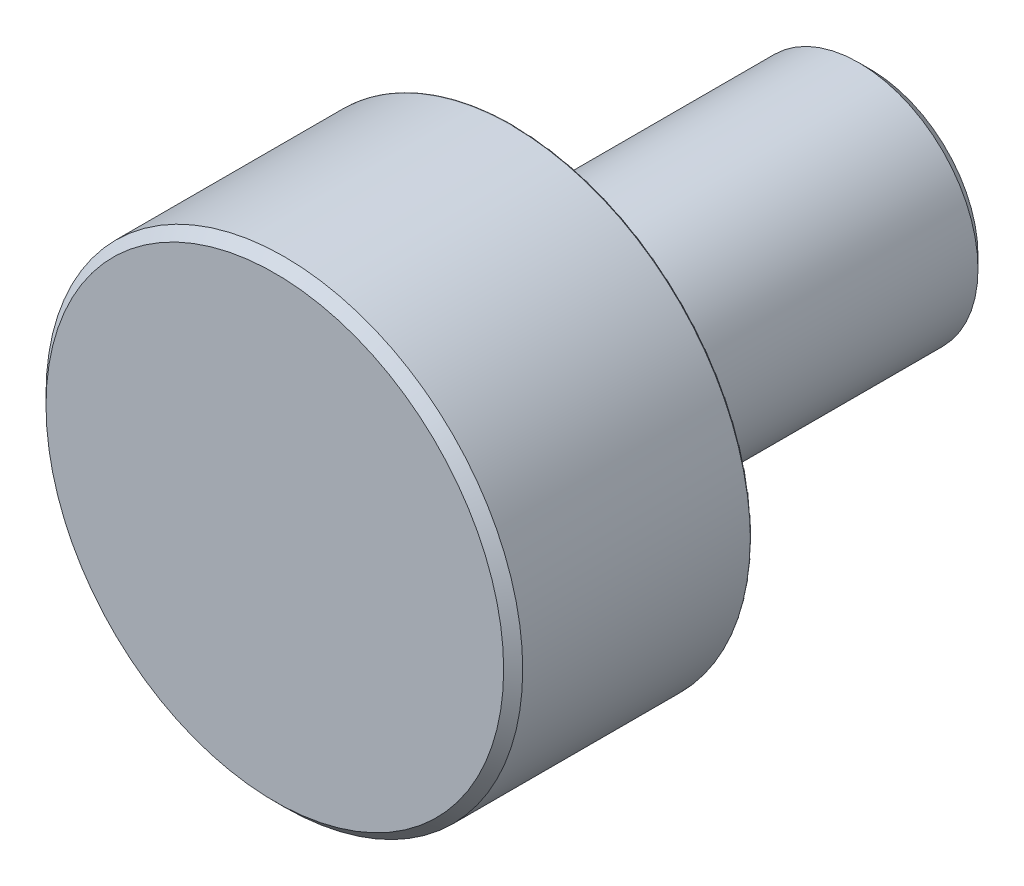
ISO-10303-21;
HEADER;
FILE_DESCRIPTION(('STEP AP214'),'2;1');
FILE_NAME('part.step','',(''),(''),'','','');
FILE_SCHEMA(('AUTOMOTIVE_DESIGN { 1 0 10303 214 1 1 1 1 }'));
ENDSEC;
DATA;
#1=APPLICATION_CONTEXT('core data for automotive mechanical design processes');
#2=APPLICATION_PROTOCOL_DEFINITION('international standard','automotive_design',2000,#1);
#3=PRODUCT_CONTEXT('',#1,'mechanical');
#4=PRODUCT('Part','Part','',(#3));
#5=PRODUCT_RELATED_PRODUCT_CATEGORY('part','',(#4));
#6=PRODUCT_DEFINITION_FORMATION('','',#4);
#7=PRODUCT_DEFINITION_CONTEXT('part definition',#1,'design');
#8=PRODUCT_DEFINITION('design','',#6,#7);
#9=PRODUCT_DEFINITION_SHAPE('','',#8);
#10=(LENGTH_UNIT() NAMED_UNIT(*) SI_UNIT(.MILLI.,.METRE.));
#11=(NAMED_UNIT(*) PLANE_ANGLE_UNIT() SI_UNIT($,.RADIAN.));
#12=(NAMED_UNIT(*) SI_UNIT($,.STERADIAN.) SOLID_ANGLE_UNIT());
#13=UNCERTAINTY_MEASURE_WITH_UNIT(LENGTH_MEASURE(1.E-05),#10,'distance_accuracy_value','');
#14=(GEOMETRIC_REPRESENTATION_CONTEXT(3) GLOBAL_UNCERTAINTY_ASSIGNED_CONTEXT((#13)) GLOBAL_UNIT_ASSIGNED_CONTEXT((#10,
#11,#12)) REPRESENTATION_CONTEXT('',''));
#15=CARTESIAN_POINT('',(0.,0.,0.));
#16=DIRECTION('',(0.,0.,1.));
#17=DIRECTION('',(1.,0.,0.));
#18=AXIS2_PLACEMENT_3D('',#15,#16,#17);
#19=CARTESIAN_POINT('',(0.,0.,7.99999999999956));
#20=DIRECTION('',(0.,0.,-0.999999999999999));
#21=DIRECTION('',(-1.,0.,0.));
#22=AXIS2_PLACEMENT_3D('',#19,#20,#21);
#23=PLANE('',#22);
#24=CARTESIAN_POINT('',(0.,0.,7.99999999999956));
#25=DIRECTION('',(0.,0.,-0.999999999999999));
#26=DIRECTION('',(-1.,0.,0.));
#27=AXIS2_PLACEMENT_3D('',#24,#25,#26);
#28=CIRCLE('',#27,7.68000000000001);
#29=CARTESIAN_POINT('',(-7.68000000000001,0.,7.99999999999956));
#30=VERTEX_POINT('',#29);
#31=EDGE_CURVE('E61',#30,#30,#28,.F.);
#32=ORIENTED_EDGE('',*,*,#31,.T.);
#33=EDGE_LOOP('',(#32));
#34=FACE_BOUND('',#33,.T.);
#35=ADVANCED_FACE('F41',(#34),#23,.F.);
#36=CARTESIAN_POINT('',(0.,0.,12.6999999999997));
#37=DIRECTION('',(0.,0.,0.999999999999999));
#38=DIRECTION('',(1.,0.,0.));
#39=AXIS2_PLACEMENT_3D('',#36,#37,#38);
#40=CYLINDRICAL_SURFACE('',#39,8.);
#41=CARTESIAN_POINT('',(0.,0.,7.67999999999969));
#42=DIRECTION('',(0.,0.,-0.999999999999999));
#43=DIRECTION('',(-1.,0.,0.));
#44=AXIS2_PLACEMENT_3D('',#41,#42,#43);
#45=CIRCLE('',#44,8.);
#46=CARTESIAN_POINT('',(8.,0.,7.67999999999969));
#47=VERTEX_POINT('',#46);
#48=EDGE_CURVE('E55',#47,#47,#45,.T.);
#49=CARTESIAN_POINT('',(0.,0.,0.0499999999999945));
#50=DIRECTION('',(0.,0.,0.999999999999999));
#51=DIRECTION('',(1.,0.,0.));
#52=AXIS2_PLACEMENT_3D('',#49,#50,#51);
#53=CIRCLE('',#52,8.);
#54=CARTESIAN_POINT('',(8.,0.,0.0499999999999945));
#55=VERTEX_POINT('',#54);
#56=EDGE_CURVE('E67',#55,#55,#53,.T.);
#57=CARTESIAN_POINT('',(8.,0.,7.67999999999969));
#58=CARTESIAN_POINT('',(8.,0.,7.60052083333302));
#59=CARTESIAN_POINT('',(8.,0.,7.52104166666636));
#60=CARTESIAN_POINT('',(8.,0.,7.36208333333303));
#61=CARTESIAN_POINT('',(8.,0.,7.28260416666637));
#62=CARTESIAN_POINT('',(8.,0.,7.12364583333304));
#63=CARTESIAN_POINT('',(8.,0.,7.04416666666638));
#64=CARTESIAN_POINT('',(8.,0.,6.88520833333305));
#65=CARTESIAN_POINT('',(8.,0.,6.80572916666639));
#66=CARTESIAN_POINT('',(8.,0.,6.64677083333306));
#67=CARTESIAN_POINT('',(8.,0.,6.5672916666664));
#68=CARTESIAN_POINT('',(8.,0.,6.40833333333307));
#69=CARTESIAN_POINT('',(8.,0.,6.32885416666641));
#70=CARTESIAN_POINT('',(8.,0.,6.16989583333308));
#71=CARTESIAN_POINT('',(8.,0.,6.09041666666642));
#72=CARTESIAN_POINT('',(8.,0.,5.93145833333309));
#73=CARTESIAN_POINT('',(8.,0.,5.85197916666643));
#74=CARTESIAN_POINT('',(8.,0.,5.6930208333331));
#75=CARTESIAN_POINT('',(8.,0.,5.61354166666644));
#76=CARTESIAN_POINT('',(8.,0.,5.45458333333311));
#77=CARTESIAN_POINT('',(8.,0.,5.37510416666645));
#78=CARTESIAN_POINT('',(8.,0.,5.21614583333312));
#79=CARTESIAN_POINT('',(8.,0.,5.13666666666646));
#80=CARTESIAN_POINT('',(8.,0.,4.97770833333313));
#81=CARTESIAN_POINT('',(8.,0.,4.89822916666647));
#82=CARTESIAN_POINT('',(8.,0.,4.73927083333314));
#83=CARTESIAN_POINT('',(8.,0.,4.65979166666648));
#84=CARTESIAN_POINT('',(8.,0.,4.50083333333315));
#85=CARTESIAN_POINT('',(8.,0.,4.42135416666649));
#86=CARTESIAN_POINT('',(8.,0.,4.26239583333316));
#87=CARTESIAN_POINT('',(8.,0.,4.18291666666649));
#88=CARTESIAN_POINT('',(8.,0.,4.02395833333317));
#89=CARTESIAN_POINT('',(8.,0.,3.94447916666651));
#90=CARTESIAN_POINT('',(8.,0.,3.78552083333318));
#91=CARTESIAN_POINT('',(8.,0.,3.70604166666652));
#92=CARTESIAN_POINT('',(8.,0.,3.54708333333319));
#93=CARTESIAN_POINT('',(8.,0.,3.46760416666653));
#94=CARTESIAN_POINT('',(8.,0.,3.3086458333332));
#95=CARTESIAN_POINT('',(8.,0.,3.22916666666653));
#96=CARTESIAN_POINT('',(8.,0.,3.07020833333321));
#97=CARTESIAN_POINT('',(8.,0.,2.99072916666654));
#98=CARTESIAN_POINT('',(8.,0.,2.83177083333322));
#99=CARTESIAN_POINT('',(8.,0.,2.75229166666655));
#100=CARTESIAN_POINT('',(8.,0.,2.59333333333323));
#101=CARTESIAN_POINT('',(8.,0.,2.51385416666656));
#102=CARTESIAN_POINT('',(8.,0.,2.35489583333323));
#103=CARTESIAN_POINT('',(8.,0.,2.27541666666657));
#104=CARTESIAN_POINT('',(8.,0.,2.11645833333325));
#105=CARTESIAN_POINT('',(8.,0.,2.03697916666658));
#106=CARTESIAN_POINT('',(8.,0.,1.87802083333326));
#107=CARTESIAN_POINT('',(8.,0.,1.79854166666659));
#108=CARTESIAN_POINT('',(8.,0.,1.63958333333327));
#109=CARTESIAN_POINT('',(8.,0.,1.5601041666666));
#110=CARTESIAN_POINT('',(8.,0.,1.40114583333327));
#111=CARTESIAN_POINT('',(8.,0.,1.32166666666661));
#112=CARTESIAN_POINT('',(8.,0.,1.16270833333328));
#113=CARTESIAN_POINT('',(8.,0.,1.08322916666662));
#114=CARTESIAN_POINT('',(8.,0.,0.924270833333293));
#115=CARTESIAN_POINT('',(8.,0.,0.844791666666629));
#116=CARTESIAN_POINT('',(8.,0.,0.685833333333302));
#117=CARTESIAN_POINT('',(8.,0.,0.606354166666639));
#118=CARTESIAN_POINT('',(8.,0.,0.447395833333312));
#119=CARTESIAN_POINT('',(8.,0.,0.367916666666648));
#120=CARTESIAN_POINT('',(8.,0.,0.208958333333321));
#121=CARTESIAN_POINT('',(8.,0.,0.129479166666658));
#122=CARTESIAN_POINT('',(8.,0.,0.0499999999999945));
#123=B_SPLINE_CURVE_WITH_KNOTS('',3,(#57,#58,#59,#60,#61,#62,#63,#64,#65,#66,#67,#68,#69,#70,
#71,#72,#73,#74,#75,#76,#77,#78,#79,#80,#81,#82,#83,#84,#85,#86,#87,#88,#89,#90,#91,#92,#93,#94,
#95,#96,#97,#98,#99,#100,#101,#102,#103,#104,#105,#106,#107,#108,#109,#110,#111,#112,#113,#114,
#115,#116,#117,#118,#119,#120,#121,#122),.UNSPECIFIED.,.F.,.F.,(4,2,2,2,2,2,2,2,2,2,2,2,2,2,2,2,
2,2,2,2,2,2,2,2,2,2,2,2,2,2,2,2,4),(0.,0.23843749999999,0.47687499999998,0.715312499999971,
0.953749999999962,1.19218749999995,1.43062499999994,1.66906249999993,1.90749999999992,
2.14593749999991,2.3843749999999,2.62281249999989,2.86124999999989,3.09968749999988,
3.33812499999987,3.57656249999986,3.81499999999985,4.05343749999984,4.29187499999983,
4.53031249999982,4.76874999999981,5.0071874999998,5.24562499999979,5.48406249999978,
5.72249999999977,5.96093749999976,6.19937499999975,6.43781249999974,6.67624999999973,
6.91468749999972,7.15312499999971,7.3915624999997,7.62999999999969),.UNSPECIFIED.);
#124=EDGE_CURVE('BSEAM113',#47,#55,#123,.T.);
#125=ORIENTED_EDGE('',*,*,#48,.T.);
#126=ORIENTED_EDGE('',*,*,#56,.T.);
#127=ORIENTED_EDGE('',*,*,#124,.T.);
#128=ORIENTED_EDGE('',*,*,#124,.F.);
#129=EDGE_LOOP('',(#125,#127,#126,#128));
#130=FACE_BOUND('',#129,.T.);
#131=ADVANCED_FACE('F113',(#130),#40,.T.);
#132=CARTESIAN_POINT('',(0.,0.,0.0499999999999945));
#133=DIRECTION('',(0.,0.,0.999999999999999));
#134=DIRECTION('',(1.,0.,0.));
#135=AXIS2_PLACEMENT_3D('',#132,#133,#134);
#136=TOROIDAL_SURFACE('',#135,7.95,0.0499999999999998);
#137=ORIENTED_EDGE('',*,*,#56,.F.);
#138=EDGE_LOOP('',(#137));
#139=FACE_BOUND('',#138,.T.);
#140=CARTESIAN_POINT('',(0.,0.,0.));
#141=DIRECTION('',(0.,0.,0.999999999999999));
#142=DIRECTION('',(1.,0.,0.));
#143=AXIS2_PLACEMENT_3D('',#140,#141,#142);
#144=CIRCLE('',#143,7.95);
#145=CARTESIAN_POINT('',(7.95,0.,0.));
#146=VERTEX_POINT('',#145);
#147=EDGE_CURVE('E71',#146,#146,#144,.T.);
#148=ORIENTED_EDGE('',*,*,#147,.T.);
#149=EDGE_LOOP('',(#148));
#150=FACE_BOUND('',#149,.T.);
#151=ADVANCED_FACE('F119',(#139,#150),#136,.T.);
#152=CARTESIAN_POINT('',(0.,7.95000000000001,0.));
#153=DIRECTION('',(0.,0.,0.999999999999999));
#154=DIRECTION('',(1.,0.,0.));
#155=AXIS2_PLACEMENT_3D('',#152,#153,#154);
#156=PLANE('',#155);
#157=ORIENTED_EDGE('',*,*,#147,.F.);
#158=EDGE_LOOP('',(#157));
#159=FACE_BOUND('',#158,.T.);
#160=CARTESIAN_POINT('',(0.,0.,0.));
#161=DIRECTION('',(0.,0.,0.999999999999999));
#162=DIRECTION('',(1.,0.,0.));
#163=AXIS2_PLACEMENT_3D('',#160,#161,#162);
#164=CIRCLE('',#163,4.44721359549996);
#165=CARTESIAN_POINT('',(4.44721359549996,0.,0.));
#166=VERTEX_POINT('',#165);
#167=EDGE_CURVE('E75',#166,#166,#164,.T.);
#168=ORIENTED_EDGE('',*,*,#167,.T.);
#169=EDGE_LOOP('',(#168));
#170=FACE_BOUND('',#169,.T.);
#171=ADVANCED_FACE('F137',(#159,#170),#156,.F.);
#172=CARTESIAN_POINT('',(0.,0.,0.0499999999999945));
#173=DIRECTION('',(0.,0.,0.999999999999999));
#174=DIRECTION('',(1.,0.,0.));
#175=AXIS2_PLACEMENT_3D('',#172,#173,#174);
#176=TOROIDAL_SURFACE('',#175,4.44721359549996,0.0499999999999996);
#177=ORIENTED_EDGE('',*,*,#167,.F.);
#178=EDGE_LOOP('',(#177));
#179=FACE_BOUND('',#178,.T.);
#180=CARTESIAN_POINT('',(0.,0.,0.0444444444444581));
#181=DIRECTION('',(0.,0.,0.999999999999999));
#182=DIRECTION('',(1.,0.,0.));
#183=AXIS2_PLACEMENT_3D('',#180,#181,#182);
#184=CIRCLE('',#183,4.39752319599996);
#185=CARTESIAN_POINT('',(4.39752319599996,0.,0.0444444444444581));
#186=VERTEX_POINT('',#185);
#187=EDGE_CURVE('E79',#186,#186,#184,.T.);
#188=ORIENTED_EDGE('',*,*,#187,.T.);
#189=EDGE_LOOP('',(#188));
#190=FACE_BOUND('',#189,.T.);
#191=ADVANCED_FACE('F142',(#179,#190),#176,.T.);
#192=CARTESIAN_POINT('',(0.,0.,0.));
#193=DIRECTION('',(0.,0.,0.999999999999999));
#194=DIRECTION('',(1.,0.,0.));
#195=AXIS2_PLACEMENT_3D('',#192,#193,#194);
#196=TOROIDAL_SURFACE('',#195,4.,0.400000000000001);
#197=ORIENTED_EDGE('',*,*,#187,.F.);
#198=EDGE_LOOP('',(#197));
#199=FACE_BOUND('',#198,.T.);
#200=CARTESIAN_POINT('',(0.,0.,0.));
#201=DIRECTION('',(0.,0.,0.999999999999999));
#202=DIRECTION('',(1.,0.,0.));
#203=AXIS2_PLACEMENT_3D('',#200,#201,#202);
#204=CIRCLE('',#203,3.6);
#205=CARTESIAN_POINT('',(3.6,0.,0.));
#206=VERTEX_POINT('',#205);
#207=EDGE_CURVE('E83',#206,#206,#204,.T.);
#208=ORIENTED_EDGE('',*,*,#207,.T.);
#209=EDGE_LOOP('',(#208));
#210=FACE_BOUND('',#209,.T.);
#211=ADVANCED_FACE('F148',(#199,#210),#196,.F.);
#212=CARTESIAN_POINT('',(0.,0.,12.6999999999997));
#213=DIRECTION('',(0.,0.,0.999999999999999));
#214=DIRECTION('',(1.,0.,0.));
#215=AXIS2_PLACEMENT_3D('',#212,#213,#214);
#216=CYLINDRICAL_SURFACE('',#215,3.6);
#217=CARTESIAN_POINT('',(0.,0.,-0.800000000000023));
#218=DIRECTION('',(0.,0.,0.999999999999999));
#219=DIRECTION('',(1.,0.,0.));
#220=AXIS2_PLACEMENT_3D('',#217,#218,#219);
#221=CIRCLE('',#220,3.6);
#222=CARTESIAN_POINT('',(3.6,0.,-0.800000000000025));
#223=VERTEX_POINT('',#222);
#224=EDGE_CURVE('E87',#223,#223,#221,.T.);
#225=CARTESIAN_POINT('',(3.6,0.,0.));
#226=CARTESIAN_POINT('',(3.6,0.,-0.00833333333333531));
#227=CARTESIAN_POINT('',(3.6,0.,-0.0166666666666689));
#228=CARTESIAN_POINT('',(3.6,0.,-0.033333333333336));
#229=CARTESIAN_POINT('',(3.6,0.,-0.0416666666666696));
#230=CARTESIAN_POINT('',(3.6,0.,-0.0583333333333367));
#231=CARTESIAN_POINT('',(3.6,0.,-0.0666666666666703));
#232=CARTESIAN_POINT('',(3.6,0.,-0.0833333333333375));
#233=CARTESIAN_POINT('',(3.6,0.,-0.091666666666671));
#234=CARTESIAN_POINT('',(3.6,0.,-0.108333333333338));
#235=CARTESIAN_POINT('',(3.6,0.,-0.116666666666672));
#236=CARTESIAN_POINT('',(3.6,0.,-0.133333333333339));
#237=CARTESIAN_POINT('',(3.6,0.,-0.141666666666672));
#238=CARTESIAN_POINT('',(3.6,0.,-0.15833333333334));
#239=CARTESIAN_POINT('',(3.6,0.,-0.166666666666673));
#240=CARTESIAN_POINT('',(3.6,0.,-0.18333333333334));
#241=CARTESIAN_POINT('',(3.6,0.,-0.191666666666674));
#242=CARTESIAN_POINT('',(3.6,0.,-0.208333333333341));
#243=CARTESIAN_POINT('',(3.6,0.,-0.216666666666675));
#244=CARTESIAN_POINT('',(3.6,0.,-0.233333333333342));
#245=CARTESIAN_POINT('',(3.6,0.,-0.241666666666675));
#246=CARTESIAN_POINT('',(3.6,0.,-0.258333333333342));
#247=CARTESIAN_POINT('',(3.6,0.,-0.266666666666676));
#248=CARTESIAN_POINT('',(3.6,0.,-0.283333333333343));
#249=CARTESIAN_POINT('',(3.6,0.,-0.291666666666677));
#250=CARTESIAN_POINT('',(3.6,0.,-0.308333333333344));
#251=CARTESIAN_POINT('',(3.6,0.,-0.316666666666677));
#252=CARTESIAN_POINT('',(3.6,0.,-0.333333333333345));
#253=CARTESIAN_POINT('',(3.6,0.,-0.341666666666678));
#254=CARTESIAN_POINT('',(3.6,0.,-0.358333333333345));
#255=CARTESIAN_POINT('',(3.6,0.,-0.366666666666679));
#256=CARTESIAN_POINT('',(3.6,0.,-0.383333333333346));
#257=CARTESIAN_POINT('',(3.6,0.,-0.39166666666668));
#258=CARTESIAN_POINT('',(3.6,0.,-0.408333333333347));
#259=CARTESIAN_POINT('',(3.6,0.,-0.41666666666668));
#260=CARTESIAN_POINT('',(3.6,0.,-0.433333333333347));
#261=CARTESIAN_POINT('',(3.6,0.,-0.441666666666681));
#262=CARTESIAN_POINT('',(3.6,0.,-0.458333333333348));
#263=CARTESIAN_POINT('',(3.6,0.,-0.466666666666682));
#264=CARTESIAN_POINT('',(3.6,0.,-0.483333333333349));
#265=CARTESIAN_POINT('',(3.6,0.,-0.491666666666682));
#266=CARTESIAN_POINT('',(3.6,0.,-0.50833333333335));
#267=CARTESIAN_POINT('',(3.6,0.,-0.516666666666683));
#268=CARTESIAN_POINT('',(3.6,0.,-0.53333333333335));
#269=CARTESIAN_POINT('',(3.6,0.,-0.541666666666684));
#270=CARTESIAN_POINT('',(3.6,0.,-0.558333333333351));
#271=CARTESIAN_POINT('',(3.6,0.,-0.566666666666685));
#272=CARTESIAN_POINT('',(3.6,0.,-0.583333333333352));
#273=CARTESIAN_POINT('',(3.6,0.,-0.591666666666685));
#274=CARTESIAN_POINT('',(3.6,0.,-0.608333333333352));
#275=CARTESIAN_POINT('',(3.6,0.,-0.616666666666686));
#276=CARTESIAN_POINT('',(3.6,0.,-0.633333333333353));
#277=CARTESIAN_POINT('',(3.6,0.,-0.641666666666687));
#278=CARTESIAN_POINT('',(3.6,0.,-0.658333333333354));
#279=CARTESIAN_POINT('',(3.6,0.,-0.666666666666688));
#280=CARTESIAN_POINT('',(3.6,0.,-0.683333333333355));
#281=CARTESIAN_POINT('',(3.6,0.,-0.691666666666688));
#282=CARTESIAN_POINT('',(3.6,0.,-0.708333333333355));
#283=CARTESIAN_POINT('',(3.6,0.,-0.716666666666689));
#284=CARTESIAN_POINT('',(3.6,0.,-0.733333333333356));
#285=CARTESIAN_POINT('',(3.6,0.,-0.74166666666669));
#286=CARTESIAN_POINT('',(3.6,0.,-0.758333333333357));
#287=CARTESIAN_POINT('',(3.6,0.,-0.76666666666669));
#288=CARTESIAN_POINT('',(3.6,0.,-0.783333333333358));
#289=CARTESIAN_POINT('',(3.6,0.,-0.791666666666691));
#290=CARTESIAN_POINT('',(3.6,0.,-0.800000000000025));
#291=B_SPLINE_CURVE_WITH_KNOTS('',3,(#225,#226,#227,#228,#229,#230,#231,#232,#233,#234,#235,
#236,#237,#238,#239,#240,#241,#242,#243,#244,#245,#246,#247,#248,#249,#250,#251,#252,#253,#254,
#255,#256,#257,#258,#259,#260,#261,#262,#263,#264,#265,#266,#267,#268,#269,#270,#271,#272,#273,
#274,#275,#276,#277,#278,#279,#280,#281,#282,#283,#284,#285,#286,#287,#288,#289,#290),
.UNSPECIFIED.,.F.,.F.,(4,2,2,2,2,2,2,2,2,2,2,2,2,2,2,2,2,2,2,2,2,2,2,2,2,2,2,2,2,2,2,2,4),(0.,
0.0250000000000007,0.0500000000000014,0.0750000000000021,0.100000000000003,0.125000000000004,
0.150000000000004,0.175000000000005,0.200000000000006,0.225000000000006,0.250000000000007,
0.275000000000008,0.300000000000009,0.325000000000009,0.35000000000001,0.375000000000011,
0.400000000000011,0.425000000000012,0.450000000000013,0.475000000000014,0.500000000000014,
0.525000000000015,0.550000000000016,0.575000000000016,0.600000000000017,0.625000000000018,
0.650000000000019,0.675000000000019,0.70000000000002,0.725000000000021,0.750000000000022,
0.775000000000022,0.800000000000023),.UNSPECIFIED.);
#292=EDGE_CURVE('BSEAM109',#206,#223,#291,.T.);
#293=ORIENTED_EDGE('',*,*,#207,.F.);
#294=ORIENTED_EDGE('',*,*,#224,.T.);
#295=ORIENTED_EDGE('',*,*,#292,.T.);
#296=ORIENTED_EDGE('',*,*,#292,.F.);
#297=EDGE_LOOP('',(#293,#295,#294,#296));
#298=FACE_BOUND('',#297,.T.);
#299=ADVANCED_FACE('F109',(#298),#216,.T.);
#300=CARTESIAN_POINT('',(0.,3.60000000000005,-0.800000000000023));
#301=DIRECTION('',(0.,0.,-0.999999999999999));
#302=DIRECTION('',(-1.,0.,0.));
#303=AXIS2_PLACEMENT_3D('',#300,#301,#302);
#304=PLANE('',#303);
#305=ORIENTED_EDGE('',*,*,#224,.F.);
#306=EDGE_LOOP('',(#305));
#307=FACE_BOUND('',#306,.T.);
#308=CARTESIAN_POINT('',(0.,0.,-0.800000000000023));
#309=DIRECTION('',(0.,0.,0.999999999999999));
#310=DIRECTION('',(1.,0.,0.));
#311=AXIS2_PLACEMENT_3D('',#308,#309,#310);
#312=CIRCLE('',#311,4.);
#313=CARTESIAN_POINT('',(4.,0.,-0.800000000000025));
#314=VERTEX_POINT('',#313);
#315=EDGE_CURVE('E91',#314,#314,#312,.T.);
#316=ORIENTED_EDGE('',*,*,#315,.T.);
#317=EDGE_LOOP('',(#316));
#318=FACE_BOUND('',#317,.T.);
#319=ADVANCED_FACE('F97',(#307,#318),#304,.F.);
#320=CARTESIAN_POINT('',(0.,0.,12.6999999999997));
#321=DIRECTION('',(0.,0.,0.999999999999999));
#322=DIRECTION('',(1.,0.,0.));
#323=AXIS2_PLACEMENT_3D('',#320,#321,#322);
#324=CYLINDRICAL_SURFACE('',#323,4.);
#325=CARTESIAN_POINT('',(0.,0.,-11.6));
#326=DIRECTION('',(0.,0.,0.999999999999999));
#327=DIRECTION('',(1.,0.,0.));
#328=AXIS2_PLACEMENT_3D('',#325,#326,#327);
#329=CIRCLE('',#328,4.);
#330=CARTESIAN_POINT('',(4.,0.,-11.6));
#331=VERTEX_POINT('',#330);
#332=EDGE_CURVE('E49',#331,#331,#329,.T.);
#333=CARTESIAN_POINT('',(4.,0.,-11.6));
#334=CARTESIAN_POINT('',(4.,0.,-11.4875));
#335=CARTESIAN_POINT('',(4.,0.,-11.375));
#336=CARTESIAN_POINT('',(4.,0.,-11.15));
#337=CARTESIAN_POINT('',(4.,0.,-11.0375));
#338=CARTESIAN_POINT('',(4.,0.,-10.8125));
#339=CARTESIAN_POINT('',(4.,0.,-10.7));
#340=CARTESIAN_POINT('',(4.,0.,-10.475));
#341=CARTESIAN_POINT('',(4.,0.,-10.3625));
#342=CARTESIAN_POINT('',(4.,0.,-10.1375));
#343=CARTESIAN_POINT('',(4.,0.,-10.025));
#344=CARTESIAN_POINT('',(4.,0.,-9.8));
#345=CARTESIAN_POINT('',(4.,0.,-9.6875));
#346=CARTESIAN_POINT('',(4.,0.,-9.4625));
#347=CARTESIAN_POINT('',(4.,0.,-9.35));
#348=CARTESIAN_POINT('',(4.,0.,-9.125));
#349=CARTESIAN_POINT('',(4.,0.,-9.0125));
#350=CARTESIAN_POINT('',(4.,0.,-8.7875));
#351=CARTESIAN_POINT('',(4.,0.,-8.67500000000001));
#352=CARTESIAN_POINT('',(4.,0.,-8.45000000000001));
#353=CARTESIAN_POINT('',(4.,0.,-8.33750000000001));
#354=CARTESIAN_POINT('',(4.,0.,-8.11250000000001));
#355=CARTESIAN_POINT('',(4.,0.,-8.00000000000001));
#356=CARTESIAN_POINT('',(4.,0.,-7.77500000000001));
#357=CARTESIAN_POINT('',(4.,0.,-7.66250000000001));
#358=CARTESIAN_POINT('',(4.,0.,-7.43750000000001));
#359=CARTESIAN_POINT('',(4.,0.,-7.32500000000001));
#360=CARTESIAN_POINT('',(4.,0.,-7.10000000000001));
#361=CARTESIAN_POINT('',(4.,0.,-6.98750000000001));
#362=CARTESIAN_POINT('',(4.,0.,-6.76250000000001));
#363=CARTESIAN_POINT('',(4.,0.,-6.65000000000001));
#364=CARTESIAN_POINT('',(4.,0.,-6.42500000000001));
#365=CARTESIAN_POINT('',(4.,0.,-6.31250000000001));
#366=CARTESIAN_POINT('',(4.,0.,-6.08750000000001));
#367=CARTESIAN_POINT('',(4.,0.,-5.97500000000001));
#368=CARTESIAN_POINT('',(4.,0.,-5.75000000000001));
#369=CARTESIAN_POINT('',(4.,0.,-5.63750000000001));
#370=CARTESIAN_POINT('',(4.,0.,-5.41250000000001));
#371=CARTESIAN_POINT('',(4.,0.,-5.30000000000001));
#372=CARTESIAN_POINT('',(4.,0.,-5.07500000000001));
#373=CARTESIAN_POINT('',(4.,0.,-4.96250000000002));
#374=CARTESIAN_POINT('',(4.,0.,-4.73750000000002));
#375=CARTESIAN_POINT('',(4.,0.,-4.62500000000002));
#376=CARTESIAN_POINT('',(4.,0.,-4.40000000000002));
#377=CARTESIAN_POINT('',(4.,0.,-4.28750000000002));
#378=CARTESIAN_POINT('',(4.,0.,-4.06250000000002));
#379=CARTESIAN_POINT('',(4.,0.,-3.95000000000002));
#380=CARTESIAN_POINT('',(4.,0.,-3.72500000000002));
#381=CARTESIAN_POINT('',(4.,0.,-3.61250000000002));
#382=CARTESIAN_POINT('',(4.,0.,-3.38750000000002));
#383=CARTESIAN_POINT('',(4.,0.,-3.27500000000002));
#384=CARTESIAN_POINT('',(4.,0.,-3.05000000000002));
#385=CARTESIAN_POINT('',(4.,0.,-2.93750000000002));
#386=CARTESIAN_POINT('',(4.,0.,-2.71250000000002));
#387=CARTESIAN_POINT('',(4.,0.,-2.60000000000002));
#388=CARTESIAN_POINT('',(4.,0.,-2.37500000000002));
#389=CARTESIAN_POINT('',(4.,0.,-2.26250000000002));
#390=CARTESIAN_POINT('',(4.,0.,-2.03750000000002));
#391=CARTESIAN_POINT('',(4.,0.,-1.92500000000002));
#392=CARTESIAN_POINT('',(4.,0.,-1.70000000000002));
#393=CARTESIAN_POINT('',(4.,0.,-1.58750000000002));
#394=CARTESIAN_POINT('',(4.,0.,-1.36250000000002));
#395=CARTESIAN_POINT('',(4.,0.,-1.25000000000002));
#396=CARTESIAN_POINT('',(4.,0.,-1.02500000000002));
#397=CARTESIAN_POINT('',(4.,0.,-0.912500000000025));
#398=CARTESIAN_POINT('',(4.,0.,-0.800000000000025));
#399=B_SPLINE_CURVE_WITH_KNOTS('',3,(#333,#334,#335,#336,#337,#338,#339,#340,#341,#342,#343,
#344,#345,#346,#347,#348,#349,#350,#351,#352,#353,#354,#355,#356,#357,#358,#359,#360,#361,#362,
#363,#364,#365,#366,#367,#368,#369,#370,#371,#372,#373,#374,#375,#376,#377,#378,#379,#380,#381,
#382,#383,#384,#385,#386,#387,#388,#389,#390,#391,#392,#393,#394,#395,#396,#397,#398),
.UNSPECIFIED.,.F.,.F.,(4,2,2,2,2,2,2,2,2,2,2,2,2,2,2,2,2,2,2,2,2,2,2,2,2,2,2,2,2,2,2,2,4),(0.,
0.337500000000001,0.674999999999998,1.0125,1.35,1.6875,2.025,2.3625,2.69999999999999,
3.03749999999999,3.37499999999999,3.71249999999999,4.04999999999999,4.38749999999999,
4.72499999999999,5.06249999999999,5.39999999999999,5.73749999999999,6.07499999999999,
6.41249999999999,6.74999999999998,7.08749999999998,7.42499999999998,7.76249999999998,
8.09999999999998,8.43749999999998,8.77499999999998,9.11249999999998,9.44999999999998,
9.78749999999998,10.125,10.4625,10.8),.UNSPECIFIED.);
#400=EDGE_CURVE('BSEAM99',#331,#314,#399,.T.);
#401=ORIENTED_EDGE('',*,*,#332,.T.);
#402=ORIENTED_EDGE('',*,*,#315,.F.);
#403=ORIENTED_EDGE('',*,*,#400,.T.);
#404=ORIENTED_EDGE('',*,*,#400,.F.);
#405=EDGE_LOOP('',(#401,#403,#402,#404));
#406=FACE_BOUND('',#405,.T.);
#407=ADVANCED_FACE('F99',(#406),#324,.T.);
#408=CARTESIAN_POINT('',(2.22044604925031E-13,4.,-12.));
#409=DIRECTION('',(0.,0.,0.999999999999999));
#410=DIRECTION('',(1.,0.,0.));
#411=AXIS2_PLACEMENT_3D('',#408,#409,#410);
#412=PLANE('',#411);
#413=CARTESIAN_POINT('',(0.,0.,-12.));
#414=DIRECTION('',(0.,0.,0.999999999999999));
#415=DIRECTION('',(1.,0.,0.));
#416=AXIS2_PLACEMENT_3D('',#413,#414,#415);
#417=CIRCLE('',#416,3.6);
#418=CARTESIAN_POINT('',(3.59999999999999,0.,-12.));
#419=VERTEX_POINT('',#418);
#420=EDGE_CURVE('E10',#419,#419,#417,.F.);
#421=ORIENTED_EDGE('',*,*,#420,.T.);
#422=EDGE_LOOP('',(#421));
#423=FACE_BOUND('',#422,.T.);
#424=ADVANCED_FACE('F101',(#423),#412,.F.);
#425=CARTESIAN_POINT('',(0.,0.,7.99999999999956));
#426=DIRECTION('',(0.,0.,-0.999999999999999));
#427=DIRECTION('',(-1.,0.,0.));
#428=AXIS2_PLACEMENT_3D('',#425,#426,#427);
#429=CONICAL_SURFACE('',#428,7.68000000000001,0.785398163397443);
#430=ORIENTED_EDGE('',*,*,#48,.F.);
#431=EDGE_LOOP('',(#430));
#432=FACE_BOUND('',#431,.T.);
#433=ORIENTED_EDGE('',*,*,#31,.F.);
#434=EDGE_LOOP('',(#433));
#435=FACE_BOUND('',#434,.T.);
#436=ADVANCED_FACE('F107',(#432,#435),#429,.T.);
#437=CARTESIAN_POINT('',(0.,0.,-11.6));
#438=DIRECTION('',(0.,0.,0.999999999999999));
#439=DIRECTION('',(1.,0.,0.));
#440=AXIS2_PLACEMENT_3D('',#437,#438,#439);
#441=CONICAL_SURFACE('',#440,4.,0.785398163397448);
#442=CARTESIAN_POINT('',(3.59999999999999,0.,-12.));
#443=CARTESIAN_POINT('',(3.60416666666665,0.,-11.9958333333333));
#444=CARTESIAN_POINT('',(3.60833333333332,0.,-11.9916666666667));
#445=CARTESIAN_POINT('',(3.61666666666665,0.,-11.9833333333333));
#446=CARTESIAN_POINT('',(3.62083333333332,0.,-11.9791666666667));
#447=CARTESIAN_POINT('',(3.62916666666665,0.,-11.9708333333333));
#448=CARTESIAN_POINT('',(3.63333333333332,0.,-11.9666666666667));
#449=CARTESIAN_POINT('',(3.64166666666666,0.,-11.9583333333333));
#450=CARTESIAN_POINT('',(3.64583333333332,0.,-11.9541666666667));
#451=CARTESIAN_POINT('',(3.65416666666666,0.,-11.9458333333333));
#452=CARTESIAN_POINT('',(3.65833333333332,0.,-11.9416666666667));
#453=CARTESIAN_POINT('',(3.66666666666666,0.,-11.9333333333333));
#454=CARTESIAN_POINT('',(3.67083333333332,0.,-11.9291666666667));
#455=CARTESIAN_POINT('',(3.67916666666666,0.,-11.9208333333333));
#456=CARTESIAN_POINT('',(3.68333333333332,0.,-11.9166666666667));
#457=CARTESIAN_POINT('',(3.69166666666666,0.,-11.9083333333333));
#458=CARTESIAN_POINT('',(3.69583333333332,0.,-11.9041666666667));
#459=CARTESIAN_POINT('',(3.70416666666666,0.,-11.8958333333333));
#460=CARTESIAN_POINT('',(3.70833333333332,0.,-11.8916666666667));
#461=CARTESIAN_POINT('',(3.71666666666666,0.,-11.8833333333333));
#462=CARTESIAN_POINT('',(3.72083333333332,0.,-11.8791666666667));
#463=CARTESIAN_POINT('',(3.72916666666666,0.,-11.8708333333333));
#464=CARTESIAN_POINT('',(3.73333333333332,0.,-11.8666666666667));
#465=CARTESIAN_POINT('',(3.74166666666666,0.,-11.8583333333333));
#466=CARTESIAN_POINT('',(3.74583333333333,0.,-11.8541666666667));
#467=CARTESIAN_POINT('',(3.75416666666666,0.,-11.8458333333333));
#468=CARTESIAN_POINT('',(3.75833333333333,0.,-11.8416666666667));
#469=CARTESIAN_POINT('',(3.76666666666666,0.,-11.8333333333333));
#470=CARTESIAN_POINT('',(3.77083333333333,0.,-11.8291666666667));
#471=CARTESIAN_POINT('',(3.77916666666666,0.,-11.8208333333333));
#472=CARTESIAN_POINT('',(3.78333333333333,0.,-11.8166666666667));
#473=CARTESIAN_POINT('',(3.79166666666666,0.,-11.8083333333333));
#474=CARTESIAN_POINT('',(3.79583333333333,0.,-11.8041666666667));
#475=CARTESIAN_POINT('',(3.80416666666666,0.,-11.7958333333333));
#476=CARTESIAN_POINT('',(3.80833333333333,0.,-11.7916666666667));
#477=CARTESIAN_POINT('',(3.81666666666666,0.,-11.7833333333333));
#478=CARTESIAN_POINT('',(3.82083333333333,0.,-11.7791666666667));
#479=CARTESIAN_POINT('',(3.82916666666666,0.,-11.7708333333333));
#480=CARTESIAN_POINT('',(3.83333333333333,0.,-11.7666666666667));
#481=CARTESIAN_POINT('',(3.84166666666666,0.,-11.7583333333333));
#482=CARTESIAN_POINT('',(3.84583333333333,0.,-11.7541666666667));
#483=CARTESIAN_POINT('',(3.85416666666666,0.,-11.7458333333333));
#484=CARTESIAN_POINT('',(3.85833333333333,0.,-11.7416666666667));
#485=CARTESIAN_POINT('',(3.86666666666666,0.,-11.7333333333333));
#486=CARTESIAN_POINT('',(3.87083333333333,0.,-11.7291666666667));
#487=CARTESIAN_POINT('',(3.87916666666666,0.,-11.7208333333333));
#488=CARTESIAN_POINT('',(3.88333333333333,0.,-11.7166666666667));
#489=CARTESIAN_POINT('',(3.89166666666666,0.,-11.7083333333333));
#490=CARTESIAN_POINT('',(3.89583333333333,0.,-11.7041666666667));
#491=CARTESIAN_POINT('',(3.90416666666666,0.,-11.6958333333333));
#492=CARTESIAN_POINT('',(3.90833333333333,0.,-11.6916666666667));
#493=CARTESIAN_POINT('',(3.91666666666666,0.,-11.6833333333333));
#494=CARTESIAN_POINT('',(3.92083333333333,0.,-11.6791666666667));
#495=CARTESIAN_POINT('',(3.92916666666666,0.,-11.6708333333333));
#496=CARTESIAN_POINT('',(3.93333333333333,0.,-11.6666666666667));
#497=CARTESIAN_POINT('',(3.94166666666666,0.,-11.6583333333333));
#498=CARTESIAN_POINT('',(3.94583333333333,0.,-11.6541666666667));
#499=CARTESIAN_POINT('',(3.95416666666666,0.,-11.6458333333333));
#500=CARTESIAN_POINT('',(3.95833333333333,0.,-11.6416666666667));
#501=CARTESIAN_POINT('',(3.96666666666667,0.,-11.6333333333333));
#502=CARTESIAN_POINT('',(3.97083333333333,0.,-11.6291666666667));
#503=CARTESIAN_POINT('',(3.97916666666666,0.,-11.6208333333333));
#504=CARTESIAN_POINT('',(3.98333333333333,0.,-11.6166666666667));
#505=CARTESIAN_POINT('',(3.99166666666667,0.,-11.6083333333333));
#506=CARTESIAN_POINT('',(3.99583333333333,0.,-11.6041666666667));
#507=CARTESIAN_POINT('',(4.,0.,-11.6));
#508=B_SPLINE_CURVE_WITH_KNOTS('',3,(#442,#443,#444,#445,#446,#447,#448,#449,#450,#451,#452,
#453,#454,#455,#456,#457,#458,#459,#460,#461,#462,#463,#464,#465,#466,#467,#468,#469,#470,#471,
#472,#473,#474,#475,#476,#477,#478,#479,#480,#481,#482,#483,#484,#485,#486,#487,#488,#489,#490,
#491,#492,#493,#494,#495,#496,#497,#498,#499,#500,#501,#502,#503,#504,#505,#506,#507),
.UNSPECIFIED.,.F.,.F.,(4,2,2,2,2,2,2,2,2,2,2,2,2,2,2,2,2,2,2,2,2,2,2,2,2,2,2,2,2,2,2,2,4),(0.,
0.0176776695296642,0.0353553390593284,0.0530330085889926,0.0707106781186568,0.088388347648321,
0.106066017177985,0.123743686707649,0.141421356237314,0.159099025766978,0.176776695296642,
0.194454364826306,0.21213203435597,0.229809703885635,0.247487373415299,0.265165042944963,
0.282842712474628,0.300520382004292,0.318198051533956,0.33587572106362,0.353553390593284,
0.371231060122948,0.388908729652614,0.406586399182277,0.424264068711941,0.441941738241605,
0.459619407771269,0.477297077300934,0.494974746830598,0.512652416360262,0.530330085889927,
0.548007755419592,0.565685424949256),.UNSPECIFIED.);
#509=EDGE_CURVE('BSEAM43',#419,#331,#508,.T.);
#510=ORIENTED_EDGE('',*,*,#420,.F.);
#511=ORIENTED_EDGE('',*,*,#332,.F.);
#512=ORIENTED_EDGE('',*,*,#509,.T.);
#513=ORIENTED_EDGE('',*,*,#509,.F.);
#514=EDGE_LOOP('',(#510,#512,#511,#513));
#515=FACE_BOUND('',#514,.T.);
#516=ADVANCED_FACE('F43',(#515),#441,.T.);
#517=CLOSED_SHELL('',(#35,#131,#151,#171,#191,#211,#299,#319,#407,#424,#436,#516));
#518=MANIFOLD_SOLID_BREP('B2',#517);
#519=ADVANCED_BREP_SHAPE_REPRESENTATION('',(#18,#518),#14);
#520=SHAPE_DEFINITION_REPRESENTATION(#9,#519);
ENDSEC;
END-ISO-10303-21;
